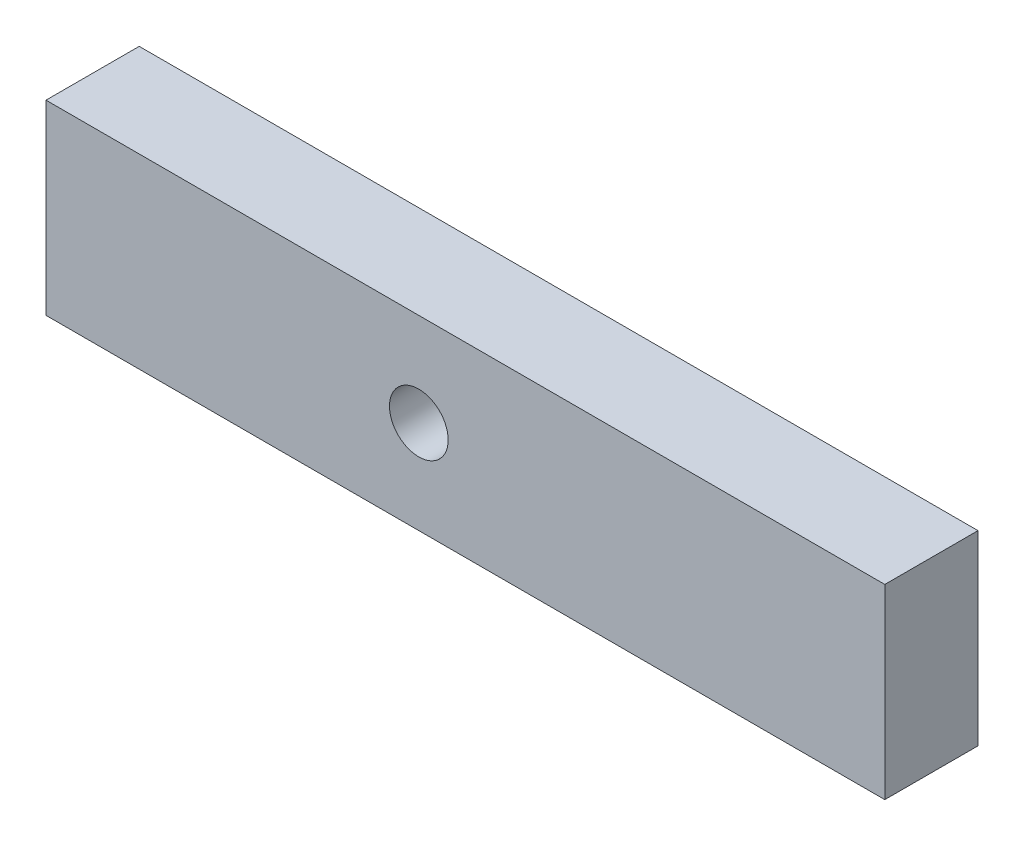
ISO-10303-21;
HEADER;
FILE_DESCRIPTION(('STEP AP214'),'2;1');
FILE_NAME('part.step','',(''),(''),'','','');
FILE_SCHEMA(('AUTOMOTIVE_DESIGN { 1 0 10303 214 1 1 1 1 }'));
ENDSEC;
DATA;
#1=APPLICATION_CONTEXT('core data for automotive mechanical design processes');
#2=APPLICATION_PROTOCOL_DEFINITION('international standard','automotive_design',2000,#1);
#3=PRODUCT_CONTEXT('',#1,'mechanical');
#4=PRODUCT('Part','Part','',(#3));
#5=PRODUCT_RELATED_PRODUCT_CATEGORY('part','',(#4));
#6=PRODUCT_DEFINITION_FORMATION('','',#4);
#7=PRODUCT_DEFINITION_CONTEXT('part definition',#1,'design');
#8=PRODUCT_DEFINITION('design','',#6,#7);
#9=PRODUCT_DEFINITION_SHAPE('','',#8);
#10=(LENGTH_UNIT() NAMED_UNIT(*) SI_UNIT(.MILLI.,.METRE.));
#11=(NAMED_UNIT(*) PLANE_ANGLE_UNIT() SI_UNIT($,.RADIAN.));
#12=(NAMED_UNIT(*) SI_UNIT($,.STERADIAN.) SOLID_ANGLE_UNIT());
#13=UNCERTAINTY_MEASURE_WITH_UNIT(LENGTH_MEASURE(1.E-05),#10,'distance_accuracy_value','');
#14=(GEOMETRIC_REPRESENTATION_CONTEXT(3) GLOBAL_UNCERTAINTY_ASSIGNED_CONTEXT((#13)) GLOBAL_UNIT_ASSIGNED_CONTEXT((#10,
#11,#12)) REPRESENTATION_CONTEXT('',''));
#15=CARTESIAN_POINT('',(0.,0.,0.));
#16=DIRECTION('',(0.,0.,1.));
#17=DIRECTION('',(1.,0.,0.));
#18=AXIS2_PLACEMENT_3D('',#15,#16,#17);
#19=CARTESIAN_POINT('',(0.,0.,12.7));
#20=DIRECTION('',(0.,0.,-1.));
#21=DIRECTION('',(-1.,0.,0.));
#22=AXIS2_PLACEMENT_3D('',#19,#20,#21);
#23=PLANE('',#22);
#24=DIRECTION('',(0.,-1.,0.));
#25=VECTOR('',#24,1.);
#26=CARTESIAN_POINT('',(0.,0.,12.7));
#27=LINE('',#26,#25);
#28=CARTESIAN_POINT('',(0.,25.4,12.7));
#29=VERTEX_POINT('',#28);
#30=CARTESIAN_POINT('',(0.,0.,12.7));
#31=VERTEX_POINT('',#30);
#32=EDGE_CURVE('E85',#29,#31,#27,.T.);
#33=ORIENTED_EDGE('',*,*,#32,.T.);
#34=DIRECTION('',(1.,0.,0.));
#35=VECTOR('',#34,1.);
#36=CARTESIAN_POINT('',(0.,0.,12.7));
#37=LINE('',#36,#35);
#38=CARTESIAN_POINT('',(114.3,0.,12.7));
#39=VERTEX_POINT('',#38);
#40=EDGE_CURVE('E80',#31,#39,#37,.T.);
#41=ORIENTED_EDGE('',*,*,#40,.T.);
#42=DIRECTION('',(0.,1.,0.));
#43=VECTOR('',#42,1.);
#44=CARTESIAN_POINT('',(114.3,0.,12.7));
#45=LINE('',#44,#43);
#46=CARTESIAN_POINT('',(114.3,25.4,12.7));
#47=VERTEX_POINT('',#46);
#48=EDGE_CURVE('E83',#39,#47,#45,.T.);
#49=ORIENTED_EDGE('',*,*,#48,.T.);
#50=DIRECTION('',(-1.,0.,0.));
#51=VECTOR('',#50,1.);
#52=CARTESIAN_POINT('',(0.,25.4,12.7));
#53=LINE('',#52,#51);
#54=EDGE_CURVE('E50',#47,#29,#53,.T.);
#55=ORIENTED_EDGE('',*,*,#54,.T.);
#56=EDGE_LOOP('',(#33,#41,#49,#55));
#57=FACE_BOUND('',#56,.T.);
#58=CARTESIAN_POINT('',(50.8,12.7,12.7));
#59=DIRECTION('',(0.,0.,1.));
#60=DIRECTION('',(1.,0.,0.));
#61=AXIS2_PLACEMENT_3D('',#58,#59,#60);
#62=CIRCLE('',#61,4.00000000000001);
#63=CARTESIAN_POINT('',(54.8,12.7,12.7));
#64=VERTEX_POINT('',#63);
#65=EDGE_CURVE('E100',#64,#64,#62,.T.);
#66=ORIENTED_EDGE('',*,*,#65,.F.);
#67=EDGE_LOOP('',(#66));
#68=FACE_BOUND('',#67,.T.);
#69=ADVANCED_FACE('F33',(#57,#68),#23,.F.);
#70=CARTESIAN_POINT('',(0.,0.,0.));
#71=DIRECTION('',(0.,0.,-1.));
#72=DIRECTION('',(-1.,0.,0.));
#73=AXIS2_PLACEMENT_3D('',#70,#71,#72);
#74=PLANE('',#73);
#75=DIRECTION('',(0.,-1.,0.));
#76=VECTOR('',#75,1.);
#77=CARTESIAN_POINT('',(0.,0.,0.));
#78=LINE('',#77,#76);
#79=CARTESIAN_POINT('',(0.,25.4,0.));
#80=VERTEX_POINT('',#79);
#81=CARTESIAN_POINT('',(0.,0.,0.));
#82=VERTEX_POINT('',#81);
#83=EDGE_CURVE('E97',#80,#82,#78,.T.);
#84=ORIENTED_EDGE('',*,*,#83,.F.);
#85=DIRECTION('',(-1.,0.,0.));
#86=VECTOR('',#85,1.);
#87=CARTESIAN_POINT('',(0.,25.4,0.));
#88=LINE('',#87,#86);
#89=CARTESIAN_POINT('',(114.3,25.4,0.));
#90=VERTEX_POINT('',#89);
#91=EDGE_CURVE('E73',#90,#80,#88,.T.);
#92=ORIENTED_EDGE('',*,*,#91,.F.);
#93=DIRECTION('',(0.,1.,0.));
#94=VECTOR('',#93,1.);
#95=CARTESIAN_POINT('',(114.3,0.,0.));
#96=LINE('',#95,#94);
#97=CARTESIAN_POINT('',(114.3,0.,0.));
#98=VERTEX_POINT('',#97);
#99=EDGE_CURVE('E67',#98,#90,#96,.T.);
#100=ORIENTED_EDGE('',*,*,#99,.F.);
#101=DIRECTION('',(1.,0.,0.));
#102=VECTOR('',#101,1.);
#103=CARTESIAN_POINT('',(0.,0.,0.));
#104=LINE('',#103,#102);
#105=EDGE_CURVE('E89',#82,#98,#104,.T.);
#106=ORIENTED_EDGE('',*,*,#105,.F.);
#107=EDGE_LOOP('',(#84,#92,#100,#106));
#108=FACE_BOUND('',#107,.T.);
#109=CARTESIAN_POINT('',(50.8,12.7,0.));
#110=DIRECTION('',(0.,0.,1.));
#111=DIRECTION('',(1.,0.,0.));
#112=AXIS2_PLACEMENT_3D('',#109,#110,#111);
#113=CIRCLE('',#112,4.00000000000001);
#114=CARTESIAN_POINT('',(54.8,12.7,0.));
#115=VERTEX_POINT('',#114);
#116=EDGE_CURVE('E112',#115,#115,#113,.T.);
#117=ORIENTED_EDGE('',*,*,#116,.T.);
#118=EDGE_LOOP('',(#117));
#119=FACE_BOUND('',#118,.T.);
#120=ADVANCED_FACE('F108',(#108,#119),#74,.T.);
#121=CARTESIAN_POINT('',(0.,0.,12.7));
#122=DIRECTION('',(1.,0.,0.));
#123=DIRECTION('',(0.,0.,-1.));
#124=AXIS2_PLACEMENT_3D('',#121,#122,#123);
#125=PLANE('',#124);
#126=ORIENTED_EDGE('',*,*,#83,.T.);
#127=DIRECTION('',(0.,0.,-1.));
#128=VECTOR('',#127,1.);
#129=CARTESIAN_POINT('',(0.,0.,12.7));
#130=LINE('',#129,#128);
#131=EDGE_CURVE('E11',#31,#82,#130,.T.);
#132=ORIENTED_EDGE('',*,*,#131,.F.);
#133=ORIENTED_EDGE('',*,*,#32,.F.);
#134=DIRECTION('',(0.,0.,-1.));
#135=VECTOR('',#134,1.);
#136=CARTESIAN_POINT('',(0.,25.4,12.7));
#137=LINE('',#136,#135);
#138=EDGE_CURVE('E93',#29,#80,#137,.T.);
#139=ORIENTED_EDGE('',*,*,#138,.T.);
#140=EDGE_LOOP('',(#126,#132,#133,#139));
#141=FACE_BOUND('',#140,.T.);
#142=ADVANCED_FACE('F35',(#141),#125,.F.);
#143=CARTESIAN_POINT('',(0.,0.,12.7));
#144=DIRECTION('',(0.,1.,0.));
#145=DIRECTION('',(0.,0.,1.));
#146=AXIS2_PLACEMENT_3D('',#143,#144,#145);
#147=PLANE('',#146);
#148=ORIENTED_EDGE('',*,*,#105,.T.);
#149=DIRECTION('',(0.,0.,-1.));
#150=VECTOR('',#149,1.);
#151=CARTESIAN_POINT('',(114.3,0.,12.7));
#152=LINE('',#151,#150);
#153=EDGE_CURVE('E42',#39,#98,#152,.T.);
#154=ORIENTED_EDGE('',*,*,#153,.F.);
#155=ORIENTED_EDGE('',*,*,#40,.F.);
#156=ORIENTED_EDGE('',*,*,#131,.T.);
#157=EDGE_LOOP('',(#148,#154,#155,#156));
#158=FACE_BOUND('',#157,.T.);
#159=ADVANCED_FACE('F88',(#158),#147,.F.);
#160=CARTESIAN_POINT('',(114.3,0.,12.7));
#161=DIRECTION('',(-1.,0.,0.));
#162=DIRECTION('',(0.,0.,1.));
#163=AXIS2_PLACEMENT_3D('',#160,#161,#162);
#164=PLANE('',#163);
#165=ORIENTED_EDGE('',*,*,#99,.T.);
#166=DIRECTION('',(0.,0.,-1.));
#167=VECTOR('',#166,1.);
#168=CARTESIAN_POINT('',(114.3,25.4,12.7));
#169=LINE('',#168,#167);
#170=EDGE_CURVE('E90',#47,#90,#169,.T.);
#171=ORIENTED_EDGE('',*,*,#170,.F.);
#172=ORIENTED_EDGE('',*,*,#48,.F.);
#173=ORIENTED_EDGE('',*,*,#153,.T.);
#174=EDGE_LOOP('',(#165,#171,#172,#173));
#175=FACE_BOUND('',#174,.T.);
#176=ADVANCED_FACE('F91',(#175),#164,.F.);
#177=CARTESIAN_POINT('',(0.,25.4,12.7));
#178=DIRECTION('',(0.,-1.,0.));
#179=DIRECTION('',(0.,0.,-1.));
#180=AXIS2_PLACEMENT_3D('',#177,#178,#179);
#181=PLANE('',#180);
#182=ORIENTED_EDGE('',*,*,#91,.T.);
#183=ORIENTED_EDGE('',*,*,#138,.F.);
#184=ORIENTED_EDGE('',*,*,#54,.F.);
#185=ORIENTED_EDGE('',*,*,#170,.T.);
#186=EDGE_LOOP('',(#182,#183,#184,#185));
#187=FACE_BOUND('',#186,.T.);
#188=ADVANCED_FACE('F105',(#187),#181,.F.);
#189=CARTESIAN_POINT('',(50.8,12.7,12.7));
#190=DIRECTION('',(0.,0.,-1.));
#191=DIRECTION('',(-1.,0.,0.));
#192=AXIS2_PLACEMENT_3D('',#189,#190,#191);
#193=CYLINDRICAL_SURFACE('',#192,4.00000000000001);
#194=ORIENTED_EDGE('',*,*,#65,.T.);
#195=EDGE_LOOP('',(#194));
#196=FACE_BOUND('',#195,.T.);
#197=ORIENTED_EDGE('',*,*,#116,.F.);
#198=EDGE_LOOP('',(#197));
#199=FACE_BOUND('',#198,.T.);
#200=ADVANCED_FACE('F118',(#196,#199),#193,.F.);
#201=CLOSED_SHELL('',(#69,#120,#142,#159,#176,#188,#200));
#202=MANIFOLD_SOLID_BREP('B2',#201);
#203=ADVANCED_BREP_SHAPE_REPRESENTATION('',(#18,#202),#14);
#204=SHAPE_DEFINITION_REPRESENTATION(#9,#203);
ENDSEC;
END-ISO-10303-21;
